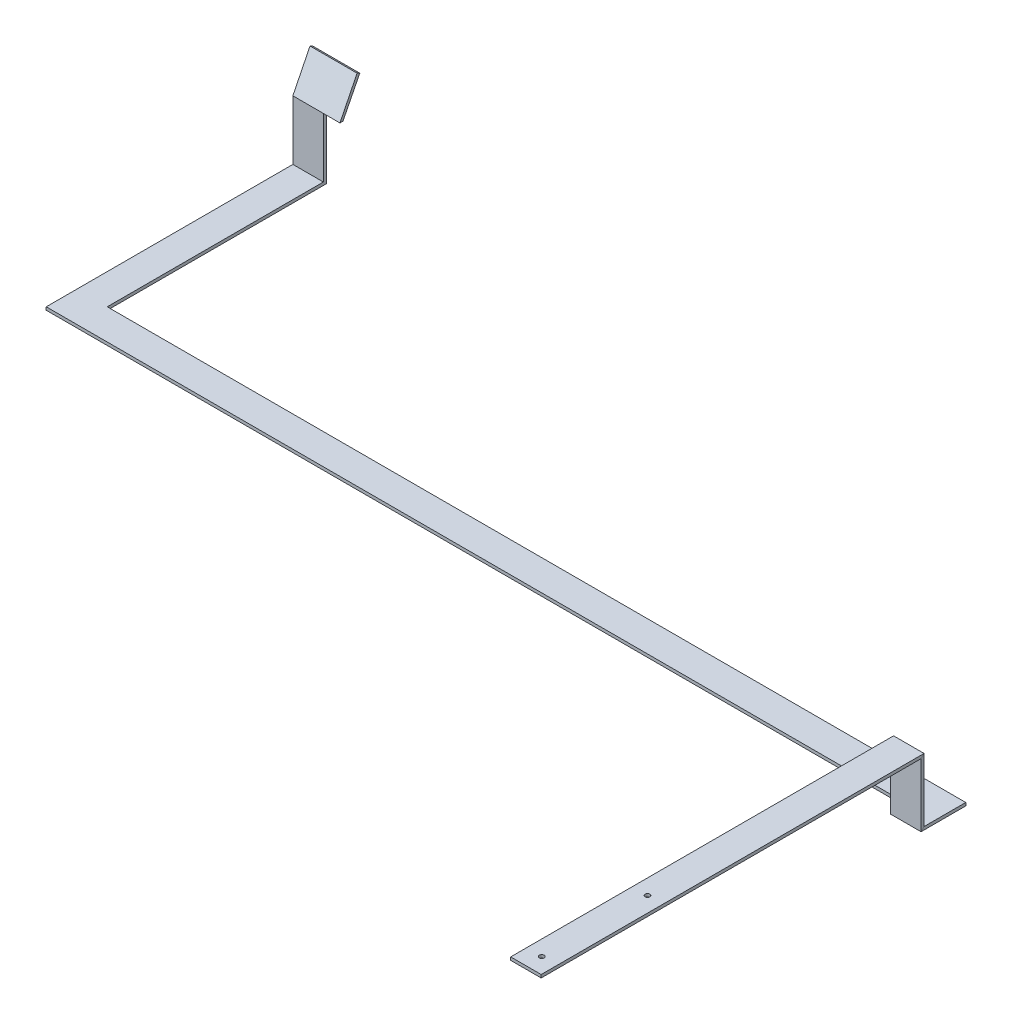
ISO-10303-21;
HEADER;
FILE_DESCRIPTION(('STEP AP214'),'2;1');
FILE_NAME('part.step','',(''),(''),'','','');
FILE_SCHEMA(('AUTOMOTIVE_DESIGN { 1 0 10303 214 1 1 1 1 }'));
ENDSEC;
DATA;
#1=APPLICATION_CONTEXT('core data for automotive mechanical design processes');
#2=APPLICATION_PROTOCOL_DEFINITION('international standard','automotive_design',2000,#1);
#3=PRODUCT_CONTEXT('',#1,'mechanical');
#4=PRODUCT('Part','Part','',(#3));
#5=PRODUCT_RELATED_PRODUCT_CATEGORY('part','',(#4));
#6=PRODUCT_DEFINITION_FORMATION('','',#4);
#7=PRODUCT_DEFINITION_CONTEXT('part definition',#1,'design');
#8=PRODUCT_DEFINITION('design','',#6,#7);
#9=PRODUCT_DEFINITION_SHAPE('','',#8);
#10=(LENGTH_UNIT() NAMED_UNIT(*) SI_UNIT(.MILLI.,.METRE.));
#11=(NAMED_UNIT(*) PLANE_ANGLE_UNIT() SI_UNIT($,.RADIAN.));
#12=(NAMED_UNIT(*) SI_UNIT($,.STERADIAN.) SOLID_ANGLE_UNIT());
#13=UNCERTAINTY_MEASURE_WITH_UNIT(LENGTH_MEASURE(1.E-05),#10,'distance_accuracy_value','');
#14=(GEOMETRIC_REPRESENTATION_CONTEXT(3) GLOBAL_UNCERTAINTY_ASSIGNED_CONTEXT((#13)) GLOBAL_UNIT_ASSIGNED_CONTEXT((#10,
#11,#12)) REPRESENTATION_CONTEXT('',''));
#15=CARTESIAN_POINT('',(0.,0.,0.));
#16=DIRECTION('',(0.,0.,1.));
#17=DIRECTION('',(1.,0.,0.));
#18=AXIS2_PLACEMENT_3D('',#15,#16,#17);
#19=CARTESIAN_POINT('',(31.75,65.,6.31));
#20=DIRECTION('',(-1.,0.,0.));
#21=DIRECTION('',(0.,-1.,0.));
#22=AXIS2_PLACEMENT_3D('',#19,#20,#21);
#23=PLANE('',#22);
#24=DIRECTION('',(0.,1.,0.));
#25=VECTOR('',#24,1.);
#26=CARTESIAN_POINT('',(31.75,-65.,456.25));
#27=LINE('',#26,#25);
#28=CARTESIAN_POINT('',(31.75,-65.,456.25));
#29=VERTEX_POINT('',#28);
#30=CARTESIAN_POINT('',(31.75,-58.69,456.25));
#31=VERTEX_POINT('',#30);
#32=EDGE_CURVE('E56',#29,#31,#27,.T.);
#33=ORIENTED_EDGE('',*,*,#32,.F.);
#34=DIRECTION('',(0.,0.,-1.));
#35=VECTOR('',#34,1.);
#36=CARTESIAN_POINT('',(31.75,-65.,6.31));
#37=LINE('',#36,#35);
#38=CARTESIAN_POINT('',(31.75,-65.,0.));
#39=VERTEX_POINT('',#38);
#40=EDGE_CURVE('E295',#29,#39,#37,.T.);
#41=ORIENTED_EDGE('',*,*,#40,.T.);
#42=DIRECTION('',(0.,1.,0.));
#43=VECTOR('',#42,1.);
#44=CARTESIAN_POINT('',(31.75,65.,0.));
#45=LINE('',#44,#43);
#46=CARTESIAN_POINT('',(31.75,65.,0.));
#47=VERTEX_POINT('',#46);
#48=EDGE_CURVE('E288',#39,#47,#45,.T.);
#49=ORIENTED_EDGE('',*,*,#48,.T.);
#50=DIRECTION('',(0.,0.,-1.));
#51=VECTOR('',#50,1.);
#52=CARTESIAN_POINT('',(31.75,65.,6.31));
#53=LINE('',#52,#51);
#54=CARTESIAN_POINT('',(31.75,65.,6.31));
#55=VERTEX_POINT('',#54);
#56=EDGE_CURVE('E11',#55,#47,#53,.T.);
#57=ORIENTED_EDGE('',*,*,#56,.F.);
#58=DIRECTION('',(0.,1.,0.));
#59=VECTOR('',#58,1.);
#60=CARTESIAN_POINT('',(31.75,65.,6.31));
#61=LINE('',#60,#59);
#62=CARTESIAN_POINT('',(31.75,-58.69,6.31));
#63=VERTEX_POINT('',#62);
#64=EDGE_CURVE('E289',#63,#55,#61,.T.);
#65=ORIENTED_EDGE('',*,*,#64,.F.);
#66=DIRECTION('',(0.,0.,-1.));
#67=VECTOR('',#66,1.);
#68=CARTESIAN_POINT('',(31.75,-58.69,519.75));
#69=LINE('',#68,#67);
#70=EDGE_CURVE('E286',#31,#63,#69,.T.);
#71=ORIENTED_EDGE('',*,*,#70,.F.);
#72=EDGE_LOOP('',(#33,#41,#49,#57,#65,#71));
#73=FACE_BOUND('',#72,.T.);
#74=ADVANCED_FACE('F34',(#73),#23,.F.);
#75=CARTESIAN_POINT('',(-31.75,65.,6.31));
#76=DIRECTION('',(1.,0.,0.));
#77=DIRECTION('',(0.,1.,0.));
#78=AXIS2_PLACEMENT_3D('',#75,#76,#77);
#79=PLANE('',#78);
#80=DIRECTION('',(0.,-1.,0.));
#81=VECTOR('',#80,1.);
#82=CARTESIAN_POINT('',(-31.75,65.,0.));
#83=LINE('',#82,#81);
#84=CARTESIAN_POINT('',(-31.75,65.,0.));
#85=VERTEX_POINT('',#84);
#86=CARTESIAN_POINT('',(-31.75,-65.,0.));
#87=VERTEX_POINT('',#86);
#88=EDGE_CURVE('E300',#85,#87,#83,.T.);
#89=ORIENTED_EDGE('',*,*,#88,.T.);
#90=DIRECTION('',(0.,0.,-1.));
#91=VECTOR('',#90,1.);
#92=CARTESIAN_POINT('',(-31.75,-65.,6.31));
#93=LINE('',#92,#91);
#94=CARTESIAN_POINT('',(-31.75,-65.,519.75));
#95=VERTEX_POINT('',#94);
#96=EDGE_CURVE('E41',#95,#87,#93,.T.);
#97=ORIENTED_EDGE('',*,*,#96,.F.);
#98=DIRECTION('',(0.,-1.,0.));
#99=VECTOR('',#98,1.);
#100=CARTESIAN_POINT('',(-31.75,-58.69,519.75));
#101=LINE('',#100,#99);
#102=CARTESIAN_POINT('',(-31.75,-58.69,519.75));
#103=VERTEX_POINT('',#102);
#104=EDGE_CURVE('E276',#103,#95,#101,.T.);
#105=ORIENTED_EDGE('',*,*,#104,.F.);
#106=DIRECTION('',(0.,0.,-1.));
#107=VECTOR('',#106,1.);
#108=CARTESIAN_POINT('',(-31.75,-58.69,519.75));
#109=LINE('',#108,#107);
#110=CARTESIAN_POINT('',(-31.75,-58.69,6.31));
#111=VERTEX_POINT('',#110);
#112=EDGE_CURVE('E281',#103,#111,#109,.T.);
#113=ORIENTED_EDGE('',*,*,#112,.T.);
#114=DIRECTION('',(0.,-1.,0.));
#115=VECTOR('',#114,1.);
#116=CARTESIAN_POINT('',(-31.75,65.,6.31));
#117=LINE('',#116,#115);
#118=CARTESIAN_POINT('',(-31.75,65.,6.31));
#119=VERTEX_POINT('',#118);
#120=EDGE_CURVE('E293',#119,#111,#117,.T.);
#121=ORIENTED_EDGE('',*,*,#120,.F.);
#122=DIRECTION('',(0.,0.895812131433514,-0.44443292539656));
#123=VECTOR('',#122,1.);
#124=CARTESIAN_POINT('',(-31.75,136.933019371323,-29.3776192116822));
#125=LINE('',#124,#123);
#126=CARTESIAN_POINT('',(-31.75,136.933019371323,-29.3776192116822));
#127=VERTEX_POINT('',#126);
#128=EDGE_CURVE('E188',#119,#127,#125,.T.);
#129=ORIENTED_EDGE('',*,*,#128,.T.);
#130=DIRECTION('',(0.,-0.452018872810554,-0.89200837362834));
#131=VECTOR('',#130,1.);
#132=CARTESIAN_POINT('',(-31.75,134.080780283889,-35.0061920492771));
#133=LINE('',#132,#131);
#134=CARTESIAN_POINT('',(-31.75,134.080780283889,-35.0061920492771));
#135=VERTEX_POINT('',#134);
#136=EDGE_CURVE('E180',#127,#135,#133,.T.);
#137=ORIENTED_EDGE('',*,*,#136,.T.);
#138=DIRECTION('',(0.,-0.89200837362834,0.452018872810554));
#139=VECTOR('',#138,1.);
#140=CARTESIAN_POINT('',(-31.75,65.,0.));
#141=LINE('',#140,#139);
#142=EDGE_CURVE('E177',#135,#85,#141,.T.);
#143=ORIENTED_EDGE('',*,*,#142,.T.);
#144=EDGE_LOOP('',(#89,#97,#105,#113,#121,#129,#137,#143));
#145=FACE_BOUND('',#144,.T.);
#146=ADVANCED_FACE('F356',(#145),#79,.F.);
#147=CARTESIAN_POINT('',(-31.75,-65.,6.31));
#148=DIRECTION('',(0.,1.,0.));
#149=DIRECTION('',(0.,0.,1.));
#150=AXIS2_PLACEMENT_3D('',#147,#148,#149);
#151=PLANE('',#150);
#152=DIRECTION('',(1.,0.,0.));
#153=VECTOR('',#152,1.);
#154=CARTESIAN_POINT('',(-31.75,-65.,0.));
#155=LINE('',#154,#153);
#156=EDGE_CURVE('E291',#87,#39,#155,.T.);
#157=ORIENTED_EDGE('',*,*,#156,.T.);
#158=ORIENTED_EDGE('',*,*,#40,.F.);
#159=DIRECTION('',(-1.,0.,0.));
#160=VECTOR('',#159,1.);
#161=CARTESIAN_POINT('',(1819.05,-64.9999999999998,456.25));
#162=LINE('',#161,#160);
#163=CARTESIAN_POINT('',(1819.05,-64.9999999999998,456.25));
#164=VERTEX_POINT('',#163);
#165=EDGE_CURVE('E270',#164,#29,#162,.T.);
#166=ORIENTED_EDGE('',*,*,#165,.F.);
#167=DIRECTION('',(0.,0.,-1.));
#168=VECTOR('',#167,1.);
#169=CARTESIAN_POINT('',(1819.05,-64.9999999999998,456.25));
#170=LINE('',#169,#168);
#171=CARTESIAN_POINT('',(1819.05,-64.9999999999998,549.315));
#172=VERTEX_POINT('',#171);
#173=EDGE_CURVE('E260',#172,#164,#170,.T.);
#174=ORIENTED_EDGE('',*,*,#173,.F.);
#175=DIRECTION('',(-1.,0.,0.));
#176=VECTOR('',#175,1.);
#177=CARTESIAN_POINT('',(1755.55,-64.9999999999998,549.315));
#178=LINE('',#177,#176);
#179=CARTESIAN_POINT('',(1755.55,-64.9999999999998,549.315));
#180=VERTEX_POINT('',#179);
#181=EDGE_CURVE('E198',#172,#180,#178,.T.);
#182=ORIENTED_EDGE('',*,*,#181,.T.);
#183=DIRECTION('',(0.,0.,1.));
#184=VECTOR('',#183,1.);
#185=CARTESIAN_POINT('',(1755.55,-64.9999999999998,519.75));
#186=LINE('',#185,#184);
#187=CARTESIAN_POINT('',(1755.55,-64.9999999999998,519.75));
#188=VERTEX_POINT('',#187);
#189=EDGE_CURVE('E211',#188,#180,#186,.T.);
#190=ORIENTED_EDGE('',*,*,#189,.F.);
#191=DIRECTION('',(1.,0.,0.));
#192=VECTOR('',#191,1.);
#193=CARTESIAN_POINT('',(-31.75,-65.,519.75));
#194=LINE('',#193,#192);
#195=EDGE_CURVE('E279',#95,#188,#194,.T.);
#196=ORIENTED_EDGE('',*,*,#195,.F.);
#197=ORIENTED_EDGE('',*,*,#96,.T.);
#198=EDGE_LOOP('',(#157,#158,#166,#174,#182,#190,#196,#197));
#199=FACE_BOUND('',#198,.T.);
#200=ADVANCED_FACE('F308',(#199),#151,.F.);
#201=CARTESIAN_POINT('',(0.,0.,6.31));
#202=DIRECTION('',(0.,0.,1.));
#203=DIRECTION('',(1.,0.,0.));
#204=AXIS2_PLACEMENT_3D('',#201,#202,#203);
#205=PLANE('',#204);
#206=DIRECTION('',(-1.,0.,0.));
#207=VECTOR('',#206,1.);
#208=CARTESIAN_POINT('',(-31.75,-58.69,6.31));
#209=LINE('',#208,#207);
#210=EDGE_CURVE('E273',#63,#111,#209,.T.);
#211=ORIENTED_EDGE('',*,*,#210,.F.);
#212=ORIENTED_EDGE('',*,*,#64,.T.);
#213=DIRECTION('',(-1.,0.,0.));
#214=VECTOR('',#213,1.);
#215=CARTESIAN_POINT('',(-31.75,65.,6.31));
#216=LINE('',#215,#214);
#217=EDGE_CURVE('E158',#55,#119,#216,.T.);
#218=ORIENTED_EDGE('',*,*,#217,.T.);
#219=ORIENTED_EDGE('',*,*,#120,.T.);
#220=EDGE_LOOP('',(#211,#212,#218,#219));
#221=FACE_BOUND('',#220,.T.);
#222=ADVANCED_FACE('F383',(#221),#205,.T.);
#223=CARTESIAN_POINT('',(0.,0.,0.));
#224=DIRECTION('',(0.,0.,1.));
#225=DIRECTION('',(1.,0.,0.));
#226=AXIS2_PLACEMENT_3D('',#223,#224,#225);
#227=PLANE('',#226);
#228=ORIENTED_EDGE('',*,*,#48,.F.);
#229=ORIENTED_EDGE('',*,*,#156,.F.);
#230=ORIENTED_EDGE('',*,*,#88,.F.);
#231=DIRECTION('',(-1.,0.,0.));
#232=VECTOR('',#231,1.);
#233=CARTESIAN_POINT('',(-31.75,65.,0.));
#234=LINE('',#233,#232);
#235=EDGE_CURVE('E297',#47,#85,#234,.T.);
#236=ORIENTED_EDGE('',*,*,#235,.F.);
#237=EDGE_LOOP('',(#228,#229,#230,#236));
#238=FACE_BOUND('',#237,.T.);
#239=ADVANCED_FACE('F314',(#238),#227,.F.);
#240=CARTESIAN_POINT('',(-31.75,-58.69,519.75));
#241=DIRECTION('',(0.,-1.,0.));
#242=DIRECTION('',(0.,0.,-1.));
#243=AXIS2_PLACEMENT_3D('',#240,#241,#242);
#244=PLANE('',#243);
#245=ORIENTED_EDGE('',*,*,#210,.T.);
#246=ORIENTED_EDGE('',*,*,#112,.F.);
#247=DIRECTION('',(-1.,0.,0.));
#248=VECTOR('',#247,1.);
#249=CARTESIAN_POINT('',(-31.75,-58.69,519.75));
#250=LINE('',#249,#248);
#251=CARTESIAN_POINT('',(1755.55,-58.69,519.75));
#252=VERTEX_POINT('',#251);
#253=EDGE_CURVE('E274',#252,#103,#250,.T.);
#254=ORIENTED_EDGE('',*,*,#253,.F.);
#255=DIRECTION('',(0.,0.,1.));
#256=VECTOR('',#255,1.);
#257=CARTESIAN_POINT('',(1755.55,-58.6899999999998,519.75));
#258=LINE('',#257,#256);
#259=CARTESIAN_POINT('',(1755.55,-58.6899999999998,543.005));
#260=VERTEX_POINT('',#259);
#261=EDGE_CURVE('E209',#252,#260,#258,.T.);
#262=ORIENTED_EDGE('',*,*,#261,.T.);
#263=DIRECTION('',(1.,0.,0.));
#264=VECTOR('',#263,1.);
#265=CARTESIAN_POINT('',(1755.55,-58.6899999999998,543.005));
#266=LINE('',#265,#264);
#267=CARTESIAN_POINT('',(1819.05,-58.6899999999998,543.005));
#268=VERTEX_POINT('',#267);
#269=EDGE_CURVE('E204',#260,#268,#266,.T.);
#270=ORIENTED_EDGE('',*,*,#269,.T.);
#271=DIRECTION('',(0.,0.,1.));
#272=VECTOR('',#271,1.);
#273=CARTESIAN_POINT('',(1819.05,-58.6899999999998,456.25));
#274=LINE('',#273,#272);
#275=CARTESIAN_POINT('',(1819.05,-58.6899999999998,456.25));
#276=VERTEX_POINT('',#275);
#277=EDGE_CURVE('E264',#276,#268,#274,.T.);
#278=ORIENTED_EDGE('',*,*,#277,.F.);
#279=DIRECTION('',(-1.,0.,0.));
#280=VECTOR('',#279,1.);
#281=CARTESIAN_POINT('',(1819.05,-58.6899999999998,456.25));
#282=LINE('',#281,#280);
#283=EDGE_CURVE('E266',#276,#31,#282,.T.);
#284=ORIENTED_EDGE('',*,*,#283,.T.);
#285=ORIENTED_EDGE('',*,*,#70,.T.);
#286=EDGE_LOOP('',(#245,#246,#254,#262,#270,#278,#284,#285));
#287=FACE_BOUND('',#286,.T.);
#288=ADVANCED_FACE('F353',(#287),#244,.F.);
#289=CARTESIAN_POINT('',(0.,0.,519.75));
#290=DIRECTION('',(0.,0.,1.));
#291=DIRECTION('',(1.,0.,0.));
#292=AXIS2_PLACEMENT_3D('',#289,#290,#291);
#293=PLANE('',#292);
#294=DIRECTION('',(0.,-1.,0.));
#295=VECTOR('',#294,1.);
#296=CARTESIAN_POINT('',(1755.55,-58.6899999999998,519.75));
#297=LINE('',#296,#295);
#298=EDGE_CURVE('E48',#252,#188,#297,.T.);
#299=ORIENTED_EDGE('',*,*,#298,.F.);
#300=ORIENTED_EDGE('',*,*,#253,.T.);
#301=ORIENTED_EDGE('',*,*,#104,.T.);
#302=ORIENTED_EDGE('',*,*,#195,.T.);
#303=EDGE_LOOP('',(#299,#300,#301,#302));
#304=FACE_BOUND('',#303,.T.);
#305=ADVANCED_FACE('F355',(#304),#293,.T.);
#306=CARTESIAN_POINT('',(1819.05,-64.9999999999998,456.25));
#307=DIRECTION('',(0.,0.,1.));
#308=DIRECTION('',(1.,0.,0.));
#309=AXIS2_PLACEMENT_3D('',#306,#307,#308);
#310=PLANE('',#309);
#311=ORIENTED_EDGE('',*,*,#32,.T.);
#312=ORIENTED_EDGE('',*,*,#283,.F.);
#313=DIRECTION('',(0.,1.,0.));
#314=VECTOR('',#313,1.);
#315=CARTESIAN_POINT('',(1819.05,-64.9999999999998,456.25));
#316=LINE('',#315,#314);
#317=EDGE_CURVE('E262',#164,#276,#316,.T.);
#318=ORIENTED_EDGE('',*,*,#317,.F.);
#319=ORIENTED_EDGE('',*,*,#165,.T.);
#320=EDGE_LOOP('',(#311,#312,#318,#319));
#321=FACE_BOUND('',#320,.T.);
#322=ADVANCED_FACE('F321',(#321),#310,.F.);
#323=CARTESIAN_POINT('',(1819.05,1.97302717093577E-13,0.));
#324=DIRECTION('',(1.,0.,0.));
#325=DIRECTION('',(0.,0.,-1.));
#326=AXIS2_PLACEMENT_3D('',#323,#324,#325);
#327=PLANE('',#326);
#328=ORIENTED_EDGE('',*,*,#277,.T.);
#329=DIRECTION('',(0.,-0.707106781186548,0.707106781186548));
#330=VECTOR('',#329,1.);
#331=CARTESIAN_POINT('',(1819.05,-47.0624999999998,531.3775));
#332=LINE('',#331,#330);
#333=EDGE_CURVE('E201',#268,#172,#332,.T.);
#334=ORIENTED_EDGE('',*,*,#333,.T.);
#335=ORIENTED_EDGE('',*,*,#173,.T.);
#336=ORIENTED_EDGE('',*,*,#317,.T.);
#337=EDGE_LOOP('',(#328,#334,#335,#336));
#338=FACE_BOUND('',#337,.T.);
#339=ADVANCED_FACE('F325',(#338),#327,.T.);
#340=CARTESIAN_POINT('',(0.,131.76,1340.16));
#341=DIRECTION('',(0.,0.,1.));
#342=DIRECTION('',(1.,0.,0.));
#343=AXIS2_PLACEMENT_3D('',#340,#341,#342);
#344=PLANE('',#343);
#345=DIRECTION('',(0.,1.,0.));
#346=VECTOR('',#345,1.);
#347=CARTESIAN_POINT('',(1819.05,73.0700000000003,1340.16));
#348=LINE('',#347,#346);
#349=CARTESIAN_POINT('',(1819.05,66.7600000000003,1340.16));
#350=VERTEX_POINT('',#349);
#351=CARTESIAN_POINT('',(1819.05,73.0700000000003,1340.16));
#352=VERTEX_POINT('',#351);
#353=EDGE_CURVE('E243',#350,#352,#348,.T.);
#354=ORIENTED_EDGE('',*,*,#353,.T.);
#355=DIRECTION('',(-1.,0.,0.));
#356=VECTOR('',#355,1.);
#357=CARTESIAN_POINT('',(1755.55,73.0700000000003,1340.16));
#358=LINE('',#357,#356);
#359=CARTESIAN_POINT('',(1755.55,73.0700000000003,1340.16));
#360=VERTEX_POINT('',#359);
#361=EDGE_CURVE('E194',#352,#360,#358,.T.);
#362=ORIENTED_EDGE('',*,*,#361,.T.);
#363=DIRECTION('',(0.,-1.,0.));
#364=VECTOR('',#363,1.);
#365=CARTESIAN_POINT('',(1755.55,73.0700000000003,1340.16));
#366=LINE('',#365,#364);
#367=CARTESIAN_POINT('',(1755.55,66.7600000000003,1340.16));
#368=VERTEX_POINT('',#367);
#369=EDGE_CURVE('E247',#360,#368,#366,.T.);
#370=ORIENTED_EDGE('',*,*,#369,.T.);
#371=DIRECTION('',(1.,0.,0.));
#372=VECTOR('',#371,1.);
#373=CARTESIAN_POINT('',(1755.55,66.7600000000003,1340.16));
#374=LINE('',#373,#372);
#375=EDGE_CURVE('E245',#368,#350,#374,.T.);
#376=ORIENTED_EDGE('',*,*,#375,.T.);
#377=EDGE_LOOP('',(#354,#362,#370,#376));
#378=FACE_BOUND('',#377,.T.);
#379=ADVANCED_FACE('F374',(#378),#344,.T.);
#380=CARTESIAN_POINT('',(1755.55,73.0700000000003,542.5895));
#381=DIRECTION('',(-1.,0.,0.));
#382=DIRECTION('',(0.,0.,1.));
#383=AXIS2_PLACEMENT_3D('',#380,#381,#382);
#384=PLANE('',#383);
#385=DIRECTION('',(0.,0.707106781186548,-0.707106781186548));
#386=VECTOR('',#385,1.);
#387=CARTESIAN_POINT('',(1755.55,3.82725000000021,612.24775));
#388=LINE('',#387,#386);
#389=CARTESIAN_POINT('',(1755.55,66.7600000000002,549.315));
#390=VERTEX_POINT('',#389);
#391=CARTESIAN_POINT('',(1755.55,73.0700000000002,543.005));
#392=VERTEX_POINT('',#391);
#393=EDGE_CURVE('E226',#390,#392,#388,.T.);
#394=ORIENTED_EDGE('',*,*,#393,.F.);
#395=DIRECTION('',(0.,0.,1.));
#396=VECTOR('',#395,1.);
#397=CARTESIAN_POINT('',(1755.55,66.7600000000003,542.5895));
#398=LINE('',#397,#396);
#399=EDGE_CURVE('E255',#390,#368,#398,.T.);
#400=ORIENTED_EDGE('',*,*,#399,.T.);
#401=ORIENTED_EDGE('',*,*,#369,.F.);
#402=DIRECTION('',(0.,0.,1.));
#403=VECTOR('',#402,1.);
#404=CARTESIAN_POINT('',(1755.55,73.0700000000003,542.5895));
#405=LINE('',#404,#403);
#406=EDGE_CURVE('E231',#392,#360,#405,.T.);
#407=ORIENTED_EDGE('',*,*,#406,.F.);
#408=EDGE_LOOP('',(#394,#400,#401,#407));
#409=FACE_BOUND('',#408,.T.);
#410=ADVANCED_FACE('F400',(#409),#384,.T.);
#411=CARTESIAN_POINT('',(1755.55,66.7600000000003,542.5895));
#412=DIRECTION('',(0.,-1.,0.));
#413=DIRECTION('',(0.,0.,-1.));
#414=AXIS2_PLACEMENT_3D('',#411,#412,#413);
#415=PLANE('',#414);
#416=CARTESIAN_POINT('',(1787.3,66.7600000000003,1087.16));
#417=DIRECTION('',(0.,-1.,0.));
#418=DIRECTION('',(0.,0.,-1.));
#419=AXIS2_PLACEMENT_3D('',#416,#417,#418);
#420=CIRCLE('',#419,4.99999999999983);
#421=CARTESIAN_POINT('',(1787.3,66.7600000000003,1082.16));
#422=VERTEX_POINT('',#421);
#423=EDGE_CURVE('E443',#422,#422,#420,.T.);
#424=ORIENTED_EDGE('',*,*,#423,.F.);
#425=EDGE_LOOP('',(#424));
#426=FACE_BOUND('',#425,.T.);
#427=CARTESIAN_POINT('',(1787.3,66.7600000000003,1307.16));
#428=DIRECTION('',(0.,-1.,0.));
#429=DIRECTION('',(0.,0.,-1.));
#430=AXIS2_PLACEMENT_3D('',#427,#428,#429);
#431=CIRCLE('',#430,4.99999999999983);
#432=CARTESIAN_POINT('',(1787.3,66.7600000000003,1302.16));
#433=VERTEX_POINT('',#432);
#434=EDGE_CURVE('E183',#433,#433,#431,.T.);
#435=ORIENTED_EDGE('',*,*,#434,.F.);
#436=EDGE_LOOP('',(#435));
#437=FACE_BOUND('',#436,.T.);
#438=DIRECTION('',(-1.,0.,0.));
#439=VECTOR('',#438,1.);
#440=CARTESIAN_POINT('',(1755.55,66.7600000000003,549.315));
#441=LINE('',#440,#439);
#442=CARTESIAN_POINT('',(1819.05,66.7600000000003,549.315));
#443=VERTEX_POINT('',#442);
#444=EDGE_CURVE('E210',#443,#390,#441,.T.);
#445=ORIENTED_EDGE('',*,*,#444,.F.);
#446=DIRECTION('',(0.,0.,1.));
#447=VECTOR('',#446,1.);
#448=CARTESIAN_POINT('',(1819.05,66.7600000000003,542.5895));
#449=LINE('',#448,#447);
#450=EDGE_CURVE('E252',#443,#350,#449,.T.);
#451=ORIENTED_EDGE('',*,*,#450,.T.);
#452=ORIENTED_EDGE('',*,*,#375,.F.);
#453=ORIENTED_EDGE('',*,*,#399,.F.);
#454=EDGE_LOOP('',(#445,#451,#452,#453));
#455=FACE_BOUND('',#454,.T.);
#456=ADVANCED_FACE('F407',(#426,#437,#455),#415,.T.);
#457=CARTESIAN_POINT('',(1819.05,73.0700000000003,542.5895));
#458=DIRECTION('',(1.,0.,0.));
#459=DIRECTION('',(0.,0.,-1.));
#460=AXIS2_PLACEMENT_3D('',#457,#458,#459);
#461=PLANE('',#460);
#462=DIRECTION('',(0.,-0.707106781186548,0.707106781186548));
#463=VECTOR('',#462,1.);
#464=CARTESIAN_POINT('',(1819.05,3.82725000000021,612.24775));
#465=LINE('',#464,#463);
#466=CARTESIAN_POINT('',(1819.05,73.0700000000002,543.005));
#467=VERTEX_POINT('',#466);
#468=EDGE_CURVE('E220',#467,#443,#465,.T.);
#469=ORIENTED_EDGE('',*,*,#468,.F.);
#470=DIRECTION('',(0.,0.,1.));
#471=VECTOR('',#470,1.);
#472=CARTESIAN_POINT('',(1819.05,73.0700000000003,542.5895));
#473=LINE('',#472,#471);
#474=EDGE_CURVE('E249',#467,#352,#473,.T.);
#475=ORIENTED_EDGE('',*,*,#474,.T.);
#476=ORIENTED_EDGE('',*,*,#353,.F.);
#477=ORIENTED_EDGE('',*,*,#450,.F.);
#478=EDGE_LOOP('',(#469,#475,#476,#477));
#479=FACE_BOUND('',#478,.T.);
#480=ADVANCED_FACE('F338',(#479),#461,.T.);
#481=CARTESIAN_POINT('',(1755.55,73.0700000000003,542.5895));
#482=DIRECTION('',(0.,1.,0.));
#483=DIRECTION('',(0.,0.,1.));
#484=AXIS2_PLACEMENT_3D('',#481,#482,#483);
#485=PLANE('',#484);
#486=CARTESIAN_POINT('',(1787.3,73.0700000000003,1087.16));
#487=DIRECTION('',(0.,1.,0.));
#488=DIRECTION('',(0.,0.,1.));
#489=AXIS2_PLACEMENT_3D('',#486,#487,#488);
#490=CIRCLE('',#489,4.99999999999983);
#491=CARTESIAN_POINT('',(1787.3,73.0700000000003,1092.16));
#492=VERTEX_POINT('',#491);
#493=EDGE_CURVE('E446',#492,#492,#490,.T.);
#494=ORIENTED_EDGE('',*,*,#493,.F.);
#495=EDGE_LOOP('',(#494));
#496=FACE_BOUND('',#495,.T.);
#497=CARTESIAN_POINT('',(1787.3,73.0700000000003,1307.16));
#498=DIRECTION('',(0.,1.,0.));
#499=DIRECTION('',(0.,0.,1.));
#500=AXIS2_PLACEMENT_3D('',#497,#498,#499);
#501=CIRCLE('',#500,4.99999999999983);
#502=CARTESIAN_POINT('',(1787.3,73.0700000000003,1312.16));
#503=VERTEX_POINT('',#502);
#504=EDGE_CURVE('E448',#503,#503,#501,.T.);
#505=ORIENTED_EDGE('',*,*,#504,.F.);
#506=EDGE_LOOP('',(#505));
#507=FACE_BOUND('',#506,.T.);
#508=DIRECTION('',(1.,0.,0.));
#509=VECTOR('',#508,1.);
#510=CARTESIAN_POINT('',(1755.55,73.0700000000002,543.005));
#511=LINE('',#510,#509);
#512=EDGE_CURVE('E223',#392,#467,#511,.T.);
#513=ORIENTED_EDGE('',*,*,#512,.F.);
#514=ORIENTED_EDGE('',*,*,#406,.T.);
#515=ORIENTED_EDGE('',*,*,#361,.F.);
#516=ORIENTED_EDGE('',*,*,#474,.F.);
#517=EDGE_LOOP('',(#513,#514,#515,#516));
#518=FACE_BOUND('',#517,.T.);
#519=ADVANCED_FACE('F342',(#496,#507,#518),#485,.T.);
#520=CARTESIAN_POINT('',(1755.55,-65.4154999999997,543.005));
#521=DIRECTION('',(0.,0.,-1.));
#522=DIRECTION('',(-1.,0.,0.));
#523=AXIS2_PLACEMENT_3D('',#520,#521,#522);
#524=PLANE('',#523);
#525=DIRECTION('',(0.,1.,0.));
#526=VECTOR('',#525,1.);
#527=CARTESIAN_POINT('',(1755.55,-65.4154999999997,543.005));
#528=LINE('',#527,#526);
#529=EDGE_CURVE('E237',#260,#392,#528,.T.);
#530=ORIENTED_EDGE('',*,*,#529,.T.);
#531=ORIENTED_EDGE('',*,*,#512,.T.);
#532=DIRECTION('',(0.,1.,0.));
#533=VECTOR('',#532,1.);
#534=CARTESIAN_POINT('',(1819.05,-65.4154999999997,543.005));
#535=LINE('',#534,#533);
#536=EDGE_CURVE('E227',#268,#467,#535,.T.);
#537=ORIENTED_EDGE('',*,*,#536,.F.);
#538=ORIENTED_EDGE('',*,*,#269,.F.);
#539=EDGE_LOOP('',(#530,#531,#537,#538));
#540=FACE_BOUND('',#539,.T.);
#541=ADVANCED_FACE('F345',(#540),#524,.T.);
#542=CARTESIAN_POINT('',(1819.05,-65.4154999999997,543.005));
#543=DIRECTION('',(1.,0.,0.));
#544=DIRECTION('',(0.,0.,-1.));
#545=AXIS2_PLACEMENT_3D('',#542,#543,#544);
#546=PLANE('',#545);
#547=ORIENTED_EDGE('',*,*,#536,.T.);
#548=ORIENTED_EDGE('',*,*,#468,.T.);
#549=DIRECTION('',(0.,1.,0.));
#550=VECTOR('',#549,1.);
#551=CARTESIAN_POINT('',(1819.05,-65.4154999999997,549.315));
#552=LINE('',#551,#550);
#553=EDGE_CURVE('E230',#172,#443,#552,.T.);
#554=ORIENTED_EDGE('',*,*,#553,.F.);
#555=ORIENTED_EDGE('',*,*,#333,.F.);
#556=EDGE_LOOP('',(#547,#548,#554,#555));
#557=FACE_BOUND('',#556,.T.);
#558=ADVANCED_FACE('F333',(#557),#546,.T.);
#559=CARTESIAN_POINT('',(1755.55,-65.4154999999997,549.315));
#560=DIRECTION('',(0.,0.,1.));
#561=DIRECTION('',(1.,0.,0.));
#562=AXIS2_PLACEMENT_3D('',#559,#560,#561);
#563=PLANE('',#562);
#564=ORIENTED_EDGE('',*,*,#553,.T.);
#565=ORIENTED_EDGE('',*,*,#444,.T.);
#566=DIRECTION('',(0.,1.,0.));
#567=VECTOR('',#566,1.);
#568=CARTESIAN_POINT('',(1755.55,-65.4154999999997,549.315));
#569=LINE('',#568,#567);
#570=EDGE_CURVE('E234',#180,#390,#569,.T.);
#571=ORIENTED_EDGE('',*,*,#570,.F.);
#572=ORIENTED_EDGE('',*,*,#181,.F.);
#573=EDGE_LOOP('',(#564,#565,#571,#572));
#574=FACE_BOUND('',#573,.T.);
#575=ADVANCED_FACE('F331',(#574),#563,.T.);
#576=CARTESIAN_POINT('',(1755.55,-65.4154999999997,543.005));
#577=DIRECTION('',(-1.,0.,0.));
#578=DIRECTION('',(0.,0.,1.));
#579=AXIS2_PLACEMENT_3D('',#576,#577,#578);
#580=PLANE('',#579);
#581=ORIENTED_EDGE('',*,*,#570,.T.);
#582=ORIENTED_EDGE('',*,*,#393,.T.);
#583=ORIENTED_EDGE('',*,*,#529,.F.);
#584=DIRECTION('',(0.,0.707106781186548,-0.707106781186548));
#585=VECTOR('',#584,1.);
#586=CARTESIAN_POINT('',(1755.55,-47.0624999999998,531.3775));
#587=LINE('',#586,#585);
#588=EDGE_CURVE('E207',#180,#260,#587,.T.);
#589=ORIENTED_EDGE('',*,*,#588,.F.);
#590=EDGE_LOOP('',(#581,#582,#583,#589));
#591=FACE_BOUND('',#590,.T.);
#592=ADVANCED_FACE('F348',(#591),#580,.T.);
#593=CARTESIAN_POINT('',(1755.55,-58.6899999999998,519.75));
#594=DIRECTION('',(-1.,0.,0.));
#595=DIRECTION('',(0.,0.,1.));
#596=AXIS2_PLACEMENT_3D('',#593,#594,#595);
#597=PLANE('',#596);
#598=ORIENTED_EDGE('',*,*,#189,.T.);
#599=ORIENTED_EDGE('',*,*,#588,.T.);
#600=ORIENTED_EDGE('',*,*,#261,.F.);
#601=ORIENTED_EDGE('',*,*,#298,.T.);
#602=EDGE_LOOP('',(#598,#599,#600,#601));
#603=FACE_BOUND('',#602,.T.);
#604=ADVANCED_FACE('F351',(#603),#597,.T.);
#605=CARTESIAN_POINT('',(66.25,65.,0.));
#606=DIRECTION('',(0.,-1.,0.));
#607=DIRECTION('',(1.,0.,0.));
#608=AXIS2_PLACEMENT_3D('',#605,#606,#607);
#609=PLANE('',#608);
#610=DIRECTION('',(-1.,0.,0.));
#611=VECTOR('',#610,1.);
#612=CARTESIAN_POINT('',(66.25,65.,6.31));
#613=LINE('',#612,#611);
#614=CARTESIAN_POINT('',(66.25,65.,6.31));
#615=VERTEX_POINT('',#614);
#616=EDGE_CURVE('E153',#615,#55,#613,.T.);
#617=ORIENTED_EDGE('',*,*,#616,.T.);
#618=ORIENTED_EDGE('',*,*,#56,.T.);
#619=DIRECTION('',(-1.,0.,0.));
#620=VECTOR('',#619,1.);
#621=CARTESIAN_POINT('',(66.25,65.,0.));
#622=LINE('',#621,#620);
#623=CARTESIAN_POINT('',(66.25,65.,0.));
#624=VERTEX_POINT('',#623);
#625=EDGE_CURVE('E176',#624,#47,#622,.T.);
#626=ORIENTED_EDGE('',*,*,#625,.F.);
#627=DIRECTION('',(0.,0.,1.));
#628=VECTOR('',#627,1.);
#629=CARTESIAN_POINT('',(66.25,65.,0.));
#630=LINE('',#629,#628);
#631=EDGE_CURVE('E169',#624,#615,#630,.T.);
#632=ORIENTED_EDGE('',*,*,#631,.T.);
#633=EDGE_LOOP('',(#617,#618,#626,#632));
#634=FACE_BOUND('',#633,.T.);
#635=ADVANCED_FACE('F174',(#634),#609,.T.);
#636=CARTESIAN_POINT('',(66.25,65.,0.));
#637=DIRECTION('',(0.,-0.452018872810554,-0.89200837362834));
#638=DIRECTION('',(0.,0.89200837362834,-0.452018872810554));
#639=AXIS2_PLACEMENT_3D('',#636,#637,#638);
#640=PLANE('',#639);
#641=ORIENTED_EDGE('',*,*,#142,.F.);
#642=DIRECTION('',(-1.,0.,0.));
#643=VECTOR('',#642,1.);
#644=CARTESIAN_POINT('',(66.25,134.080780283889,-35.0061920492771));
#645=LINE('',#644,#643);
#646=CARTESIAN_POINT('',(66.25,134.080780283889,-35.0061920492771));
#647=VERTEX_POINT('',#646);
#648=EDGE_CURVE('E195',#647,#135,#645,.T.);
#649=ORIENTED_EDGE('',*,*,#648,.F.);
#650=DIRECTION('',(0.,-0.89200837362834,0.452018872810554));
#651=VECTOR('',#650,1.);
#652=CARTESIAN_POINT('',(66.25,65.,0.));
#653=LINE('',#652,#651);
#654=EDGE_CURVE('E162',#647,#624,#653,.T.);
#655=ORIENTED_EDGE('',*,*,#654,.T.);
#656=ORIENTED_EDGE('',*,*,#625,.T.);
#657=ORIENTED_EDGE('',*,*,#235,.T.);
#658=EDGE_LOOP('',(#641,#649,#655,#656,#657));
#659=FACE_BOUND('',#658,.T.);
#660=ADVANCED_FACE('F365',(#659),#640,.T.);
#661=CARTESIAN_POINT('',(66.25,134.080780283889,-35.0061920492771));
#662=DIRECTION('',(0.,0.89200837362834,-0.452018872810554));
#663=DIRECTION('',(0.,0.452018872810554,0.89200837362834));
#664=AXIS2_PLACEMENT_3D('',#661,#662,#663);
#665=PLANE('',#664);
#666=ORIENTED_EDGE('',*,*,#136,.F.);
#667=DIRECTION('',(-1.,0.,0.));
#668=VECTOR('',#667,1.);
#669=CARTESIAN_POINT('',(66.25,136.933019371323,-29.3776192116822));
#670=LINE('',#669,#668);
#671=CARTESIAN_POINT('',(66.25,136.933019371323,-29.3776192116822));
#672=VERTEX_POINT('',#671);
#673=EDGE_CURVE('E161',#672,#127,#670,.T.);
#674=ORIENTED_EDGE('',*,*,#673,.F.);
#675=DIRECTION('',(0.,-0.452018872810554,-0.89200837362834));
#676=VECTOR('',#675,1.);
#677=CARTESIAN_POINT('',(66.25,134.080780283889,-35.0061920492771));
#678=LINE('',#677,#676);
#679=EDGE_CURVE('E172',#672,#647,#678,.T.);
#680=ORIENTED_EDGE('',*,*,#679,.T.);
#681=ORIENTED_EDGE('',*,*,#648,.T.);
#682=EDGE_LOOP('',(#666,#674,#680,#681));
#683=FACE_BOUND('',#682,.T.);
#684=ADVANCED_FACE('F362',(#683),#665,.T.);
#685=CARTESIAN_POINT('',(66.25,136.933019371323,-29.3776192116822));
#686=DIRECTION('',(0.,0.44443292539656,0.895812131433514));
#687=DIRECTION('',(0.,-0.895812131433514,0.44443292539656));
#688=AXIS2_PLACEMENT_3D('',#685,#686,#687);
#689=PLANE('',#688);
#690=ORIENTED_EDGE('',*,*,#128,.F.);
#691=ORIENTED_EDGE('',*,*,#217,.F.);
#692=ORIENTED_EDGE('',*,*,#616,.F.);
#693=DIRECTION('',(0.,0.895812131433514,-0.44443292539656));
#694=VECTOR('',#693,1.);
#695=CARTESIAN_POINT('',(66.25,136.933019371323,-29.3776192116822));
#696=LINE('',#695,#694);
#697=EDGE_CURVE('E157',#615,#672,#696,.T.);
#698=ORIENTED_EDGE('',*,*,#697,.T.);
#699=ORIENTED_EDGE('',*,*,#673,.T.);
#700=EDGE_LOOP('',(#690,#691,#692,#698,#699));
#701=FACE_BOUND('',#700,.T.);
#702=ADVANCED_FACE('F156',(#701),#689,.T.);
#703=CARTESIAN_POINT('',(66.25,0.,0.));
#704=DIRECTION('',(1.,0.,0.));
#705=DIRECTION('',(0.,1.,0.));
#706=AXIS2_PLACEMENT_3D('',#703,#704,#705);
#707=PLANE('',#706);
#708=ORIENTED_EDGE('',*,*,#631,.F.);
#709=ORIENTED_EDGE('',*,*,#654,.F.);
#710=ORIENTED_EDGE('',*,*,#679,.F.);
#711=ORIENTED_EDGE('',*,*,#697,.F.);
#712=EDGE_LOOP('',(#708,#709,#710,#711));
#713=FACE_BOUND('',#712,.T.);
#714=ADVANCED_FACE('F167',(#713),#707,.T.);
#715=CARTESIAN_POINT('',(1787.3,63.0700000000003,1307.16));
#716=DIRECTION('',(0.,1.,0.));
#717=DIRECTION('',(0.,0.,1.));
#718=AXIS2_PLACEMENT_3D('',#715,#716,#717);
#719=CYLINDRICAL_SURFACE('',#718,4.99999999999983);
#720=ORIENTED_EDGE('',*,*,#434,.T.);
#721=EDGE_LOOP('',(#720));
#722=FACE_BOUND('',#721,.T.);
#723=ORIENTED_EDGE('',*,*,#504,.T.);
#724=EDGE_LOOP('',(#723));
#725=FACE_BOUND('',#724,.T.);
#726=ADVANCED_FACE('F428',(#722,#725),#719,.F.);
#727=CARTESIAN_POINT('',(1787.3,63.0700000000003,1087.16));
#728=DIRECTION('',(0.,1.,0.));
#729=DIRECTION('',(0.,0.,1.));
#730=AXIS2_PLACEMENT_3D('',#727,#728,#729);
#731=CYLINDRICAL_SURFACE('',#730,4.99999999999983);
#732=ORIENTED_EDGE('',*,*,#423,.T.);
#733=EDGE_LOOP('',(#732));
#734=FACE_BOUND('',#733,.T.);
#735=ORIENTED_EDGE('',*,*,#493,.T.);
#736=EDGE_LOOP('',(#735));
#737=FACE_BOUND('',#736,.T.);
#738=ADVANCED_FACE('F432',(#734,#737),#731,.F.);
#739=CLOSED_SHELL('',(#74,#146,#200,#222,#239,#288,#305,#322,#339,#379,#410,#456,#480,#519,#541,
#558,#575,#592,#604,#635,#660,#684,#702,#714,#726,#738));
#740=MANIFOLD_SOLID_BREP('B2',#739);
#741=ADVANCED_BREP_SHAPE_REPRESENTATION('',(#18,#740),#14);
#742=SHAPE_DEFINITION_REPRESENTATION(#9,#741);
ENDSEC;
END-ISO-10303-21;
